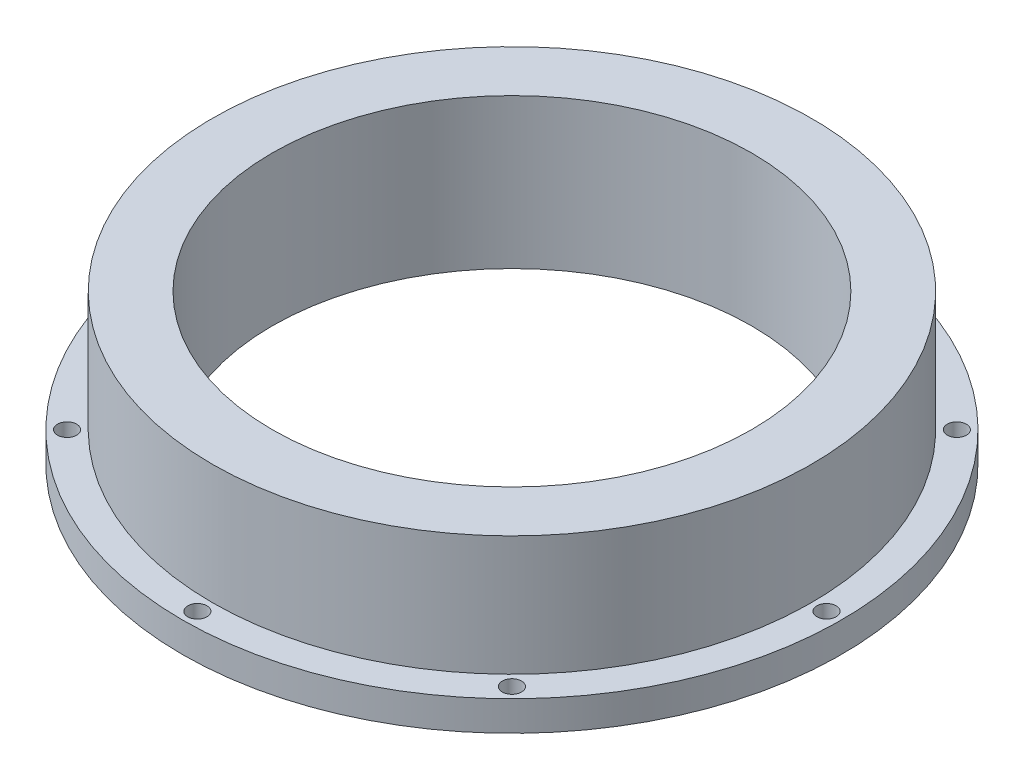
ISO-10303-21;
HEADER;
FILE_DESCRIPTION(('STEP AP214'),'2;1');
FILE_NAME('part.step','',(''),(''),'','','');
FILE_SCHEMA(('AUTOMOTIVE_DESIGN { 1 0 10303 214 1 1 1 1 }'));
ENDSEC;
DATA;
#1=APPLICATION_CONTEXT('core data for automotive mechanical design processes');
#2=APPLICATION_PROTOCOL_DEFINITION('international standard','automotive_design',2000,#1);
#3=PRODUCT_CONTEXT('',#1,'mechanical');
#4=PRODUCT('Part','Part','',(#3));
#5=PRODUCT_RELATED_PRODUCT_CATEGORY('part','',(#4));
#6=PRODUCT_DEFINITION_FORMATION('','',#4);
#7=PRODUCT_DEFINITION_CONTEXT('part definition',#1,'design');
#8=PRODUCT_DEFINITION('design','',#6,#7);
#9=PRODUCT_DEFINITION_SHAPE('','',#8);
#10=(LENGTH_UNIT() NAMED_UNIT(*) SI_UNIT(.MILLI.,.METRE.));
#11=(NAMED_UNIT(*) PLANE_ANGLE_UNIT() SI_UNIT($,.RADIAN.));
#12=(NAMED_UNIT(*) SI_UNIT($,.STERADIAN.) SOLID_ANGLE_UNIT());
#13=UNCERTAINTY_MEASURE_WITH_UNIT(LENGTH_MEASURE(1.E-05),#10,'distance_accuracy_value','');
#14=(GEOMETRIC_REPRESENTATION_CONTEXT(3) GLOBAL_UNCERTAINTY_ASSIGNED_CONTEXT((#13)) GLOBAL_UNIT_ASSIGNED_CONTEXT((#10,
#11,#12)) REPRESENTATION_CONTEXT('',''));
#15=CARTESIAN_POINT('',(0.,0.,0.));
#16=DIRECTION('',(0.,0.,1.));
#17=DIRECTION('',(1.,0.,0.));
#18=AXIS2_PLACEMENT_3D('',#15,#16,#17);
#19=CARTESIAN_POINT('',(0.,5.,0.));
#20=DIRECTION('',(0.,1.,0.));
#21=DIRECTION('',(0.,0.,1.));
#22=AXIS2_PLACEMENT_3D('',#19,#20,#21);
#23=PLANE('',#22);
#24=CARTESIAN_POINT('',(0.,5.,0.));
#25=DIRECTION('',(0.,1.,0.));
#26=DIRECTION('',(0.,0.,1.));
#27=AXIS2_PLACEMENT_3D('',#24,#25,#26);
#28=CIRCLE('',#27,50.);
#29=CARTESIAN_POINT('',(0.,5.,50.));
#30=VERTEX_POINT('',#29);
#31=EDGE_CURVE('E120',#30,#30,#28,.T.);
#32=ORIENTED_EDGE('',*,*,#31,.F.);
#33=EDGE_LOOP('',(#32));
#34=FACE_BOUND('',#33,.T.);
#35=CARTESIAN_POINT('',(-52.5,5.,0.));
#36=DIRECTION('',(0.,1.,0.));
#37=DIRECTION('',(0.,0.,1.));
#38=AXIS2_PLACEMENT_3D('',#35,#36,#37);
#39=CIRCLE('',#38,1.6);
#40=CARTESIAN_POINT('',(-52.5,5.,1.60000000000001));
#41=VERTEX_POINT('',#40);
#42=EDGE_CURVE('E100',#41,#41,#39,.T.);
#43=ORIENTED_EDGE('',*,*,#42,.F.);
#44=EDGE_LOOP('',(#43));
#45=FACE_BOUND('',#44,.T.);
#46=CARTESIAN_POINT('',(0.,5.,52.5));
#47=DIRECTION('',(0.,1.,0.));
#48=DIRECTION('',(0.,0.,1.));
#49=AXIS2_PLACEMENT_3D('',#46,#47,#48);
#50=CIRCLE('',#49,1.6);
#51=CARTESIAN_POINT('',(0.,5.,54.1));
#52=VERTEX_POINT('',#51);
#53=EDGE_CURVE('E84',#52,#52,#50,.T.);
#54=ORIENTED_EDGE('',*,*,#53,.F.);
#55=EDGE_LOOP('',(#54));
#56=FACE_BOUND('',#55,.T.);
#57=CARTESIAN_POINT('',(52.5,5.,0.));
#58=DIRECTION('',(0.,1.,0.));
#59=DIRECTION('',(0.,0.,1.));
#60=AXIS2_PLACEMENT_3D('',#57,#58,#59);
#61=CIRCLE('',#60,1.60000000000001);
#62=CARTESIAN_POINT('',(52.5,5.,1.6));
#63=VERTEX_POINT('',#62);
#64=EDGE_CURVE('E68',#63,#63,#61,.T.);
#65=ORIENTED_EDGE('',*,*,#64,.F.);
#66=EDGE_LOOP('',(#65));
#67=FACE_BOUND('',#66,.T.);
#68=CARTESIAN_POINT('',(0.,5.,-52.5));
#69=DIRECTION('',(0.,1.,0.));
#70=DIRECTION('',(0.,0.,1.));
#71=AXIS2_PLACEMENT_3D('',#68,#69,#70);
#72=CIRCLE('',#71,1.6);
#73=CARTESIAN_POINT('',(0.,5.,-50.9));
#74=VERTEX_POINT('',#73);
#75=EDGE_CURVE('E54',#74,#74,#72,.T.);
#76=ORIENTED_EDGE('',*,*,#75,.F.);
#77=EDGE_LOOP('',(#76));
#78=FACE_BOUND('',#77,.T.);
#79=CARTESIAN_POINT('',(0.,5.,0.));
#80=DIRECTION('',(0.,1.,0.));
#81=DIRECTION('',(0.,0.,1.));
#82=AXIS2_PLACEMENT_3D('',#79,#80,#81);
#83=CIRCLE('',#82,55.);
#84=CARTESIAN_POINT('',(0.,5.,55.));
#85=VERTEX_POINT('',#84);
#86=EDGE_CURVE('E10',#85,#85,#83,.T.);
#87=ORIENTED_EDGE('',*,*,#86,.T.);
#88=EDGE_LOOP('',(#87));
#89=FACE_BOUND('',#88,.T.);
#90=CARTESIAN_POINT('',(37.1231060122937,5.,-37.1231060122937));
#91=DIRECTION('',(0.,1.,0.));
#92=DIRECTION('',(0.,0.,1.));
#93=AXIS2_PLACEMENT_3D('',#90,#91,#92);
#94=CIRCLE('',#93,1.6);
#95=CARTESIAN_POINT('',(37.1231060122937,5.,-35.5231060122937));
#96=VERTEX_POINT('',#95);
#97=EDGE_CURVE('E60',#96,#96,#94,.T.);
#98=ORIENTED_EDGE('',*,*,#97,.F.);
#99=EDGE_LOOP('',(#98));
#100=FACE_BOUND('',#99,.T.);
#101=CARTESIAN_POINT('',(37.1231060122937,5.,37.1231060122937));
#102=DIRECTION('',(0.,1.,0.));
#103=DIRECTION('',(0.,0.,1.));
#104=AXIS2_PLACEMENT_3D('',#101,#102,#103);
#105=CIRCLE('',#104,1.60000000000001);
#106=CARTESIAN_POINT('',(37.1231060122937,5.,38.7231060122937));
#107=VERTEX_POINT('',#106);
#108=EDGE_CURVE('E76',#107,#107,#105,.T.);
#109=ORIENTED_EDGE('',*,*,#108,.F.);
#110=EDGE_LOOP('',(#109));
#111=FACE_BOUND('',#110,.T.);
#112=CARTESIAN_POINT('',(-37.1231060122937,5.,37.1231060122938));
#113=DIRECTION('',(0.,1.,0.));
#114=DIRECTION('',(0.,0.,1.));
#115=AXIS2_PLACEMENT_3D('',#112,#113,#114);
#116=CIRCLE('',#115,1.60000000000001);
#117=CARTESIAN_POINT('',(-37.1231060122937,5.,38.7231060122938));
#118=VERTEX_POINT('',#117);
#119=EDGE_CURVE('E92',#118,#118,#116,.T.);
#120=ORIENTED_EDGE('',*,*,#119,.F.);
#121=EDGE_LOOP('',(#120));
#122=FACE_BOUND('',#121,.T.);
#123=CARTESIAN_POINT('',(-37.1231060122938,5.,-37.1231060122937));
#124=DIRECTION('',(0.,1.,0.));
#125=DIRECTION('',(0.,0.,1.));
#126=AXIS2_PLACEMENT_3D('',#123,#124,#125);
#127=CIRCLE('',#126,1.6);
#128=CARTESIAN_POINT('',(-37.1231060122938,5.,-35.5231060122937));
#129=VERTEX_POINT('',#128);
#130=EDGE_CURVE('E108',#129,#129,#127,.T.);
#131=ORIENTED_EDGE('',*,*,#130,.F.);
#132=EDGE_LOOP('',(#131));
#133=FACE_BOUND('',#132,.T.);
#134=ADVANCED_FACE('F41',(#34,#45,#56,#67,#78,#89,#100,#111,#122,#133),#23,.T.);
#135=CARTESIAN_POINT('',(0.,0.,0.));
#136=DIRECTION('',(0.,1.,0.));
#137=DIRECTION('',(0.,0.,1.));
#138=AXIS2_PLACEMENT_3D('',#135,#136,#137);
#139=PLANE('',#138);
#140=CARTESIAN_POINT('',(0.,0.,0.));
#141=DIRECTION('',(0.,1.,0.));
#142=DIRECTION('',(0.,0.,1.));
#143=AXIS2_PLACEMENT_3D('',#140,#141,#142);
#144=CIRCLE('',#143,40.);
#145=CARTESIAN_POINT('',(0.,0.,40.));
#146=VERTEX_POINT('',#145);
#147=EDGE_CURVE('E124',#146,#146,#144,.T.);
#148=ORIENTED_EDGE('',*,*,#147,.T.);
#149=EDGE_LOOP('',(#148));
#150=FACE_BOUND('',#149,.T.);
#151=CARTESIAN_POINT('',(0.,0.,0.));
#152=DIRECTION('',(0.,1.,0.));
#153=DIRECTION('',(0.,0.,1.));
#154=AXIS2_PLACEMENT_3D('',#151,#152,#153);
#155=CIRCLE('',#154,55.);
#156=CARTESIAN_POINT('',(0.,0.,55.));
#157=VERTEX_POINT('',#156);
#158=EDGE_CURVE('E45',#157,#157,#155,.T.);
#159=ORIENTED_EDGE('',*,*,#158,.F.);
#160=EDGE_LOOP('',(#159));
#161=FACE_BOUND('',#160,.T.);
#162=CARTESIAN_POINT('',(0.,0.,-52.5));
#163=DIRECTION('',(0.,1.,0.));
#164=DIRECTION('',(0.,0.,1.));
#165=AXIS2_PLACEMENT_3D('',#162,#163,#164);
#166=CIRCLE('',#165,1.6);
#167=CARTESIAN_POINT('',(0.,0.,-50.9));
#168=VERTEX_POINT('',#167);
#169=EDGE_CURVE('E56',#168,#168,#166,.T.);
#170=ORIENTED_EDGE('',*,*,#169,.T.);
#171=EDGE_LOOP('',(#170));
#172=FACE_BOUND('',#171,.T.);
#173=CARTESIAN_POINT('',(37.1231060122937,0.,-37.1231060122937));
#174=DIRECTION('',(0.,1.,0.));
#175=DIRECTION('',(0.,0.,1.));
#176=AXIS2_PLACEMENT_3D('',#173,#174,#175);
#177=CIRCLE('',#176,1.6);
#178=CARTESIAN_POINT('',(37.1231060122937,0.,-35.5231060122937));
#179=VERTEX_POINT('',#178);
#180=EDGE_CURVE('E64',#179,#179,#177,.T.);
#181=ORIENTED_EDGE('',*,*,#180,.T.);
#182=EDGE_LOOP('',(#181));
#183=FACE_BOUND('',#182,.T.);
#184=CARTESIAN_POINT('',(52.5,0.,0.));
#185=DIRECTION('',(0.,1.,0.));
#186=DIRECTION('',(0.,0.,1.));
#187=AXIS2_PLACEMENT_3D('',#184,#185,#186);
#188=CIRCLE('',#187,1.60000000000001);
#189=CARTESIAN_POINT('',(52.5,0.,1.6));
#190=VERTEX_POINT('',#189);
#191=EDGE_CURVE('E72',#190,#190,#188,.T.);
#192=ORIENTED_EDGE('',*,*,#191,.T.);
#193=EDGE_LOOP('',(#192));
#194=FACE_BOUND('',#193,.T.);
#195=CARTESIAN_POINT('',(37.1231060122937,0.,37.1231060122937));
#196=DIRECTION('',(0.,1.,0.));
#197=DIRECTION('',(0.,0.,1.));
#198=AXIS2_PLACEMENT_3D('',#195,#196,#197);
#199=CIRCLE('',#198,1.60000000000001);
#200=CARTESIAN_POINT('',(37.1231060122937,0.,38.7231060122937));
#201=VERTEX_POINT('',#200);
#202=EDGE_CURVE('E80',#201,#201,#199,.T.);
#203=ORIENTED_EDGE('',*,*,#202,.T.);
#204=EDGE_LOOP('',(#203));
#205=FACE_BOUND('',#204,.T.);
#206=CARTESIAN_POINT('',(0.,0.,52.5));
#207=DIRECTION('',(0.,1.,0.));
#208=DIRECTION('',(0.,0.,1.));
#209=AXIS2_PLACEMENT_3D('',#206,#207,#208);
#210=CIRCLE('',#209,1.6);
#211=CARTESIAN_POINT('',(0.,0.,54.1));
#212=VERTEX_POINT('',#211);
#213=EDGE_CURVE('E88',#212,#212,#210,.T.);
#214=ORIENTED_EDGE('',*,*,#213,.T.);
#215=EDGE_LOOP('',(#214));
#216=FACE_BOUND('',#215,.T.);
#217=CARTESIAN_POINT('',(-37.1231060122937,0.,37.1231060122938));
#218=DIRECTION('',(0.,1.,0.));
#219=DIRECTION('',(0.,0.,1.));
#220=AXIS2_PLACEMENT_3D('',#217,#218,#219);
#221=CIRCLE('',#220,1.60000000000001);
#222=CARTESIAN_POINT('',(-37.1231060122937,0.,38.7231060122938));
#223=VERTEX_POINT('',#222);
#224=EDGE_CURVE('E96',#223,#223,#221,.T.);
#225=ORIENTED_EDGE('',*,*,#224,.T.);
#226=EDGE_LOOP('',(#225));
#227=FACE_BOUND('',#226,.T.);
#228=CARTESIAN_POINT('',(-52.5,0.,0.));
#229=DIRECTION('',(0.,1.,0.));
#230=DIRECTION('',(0.,0.,1.));
#231=AXIS2_PLACEMENT_3D('',#228,#229,#230);
#232=CIRCLE('',#231,1.6);
#233=CARTESIAN_POINT('',(-52.5,0.,1.60000000000001));
#234=VERTEX_POINT('',#233);
#235=EDGE_CURVE('E104',#234,#234,#232,.T.);
#236=ORIENTED_EDGE('',*,*,#235,.T.);
#237=EDGE_LOOP('',(#236));
#238=FACE_BOUND('',#237,.T.);
#239=CARTESIAN_POINT('',(-37.1231060122938,0.,-37.1231060122937));
#240=DIRECTION('',(0.,1.,0.));
#241=DIRECTION('',(0.,0.,1.));
#242=AXIS2_PLACEMENT_3D('',#239,#240,#241);
#243=CIRCLE('',#242,1.6);
#244=CARTESIAN_POINT('',(-37.1231060122938,0.,-35.5231060122937));
#245=VERTEX_POINT('',#244);
#246=EDGE_CURVE('E112',#245,#245,#243,.T.);
#247=ORIENTED_EDGE('',*,*,#246,.T.);
#248=EDGE_LOOP('',(#247));
#249=FACE_BOUND('',#248,.T.);
#250=ADVANCED_FACE('F136',(#150,#161,#172,#183,#194,#205,#216,#227,#238,#249),#139,.F.);
#251=CARTESIAN_POINT('',(0.,5.,0.));
#252=DIRECTION('',(0.,-1.,0.));
#253=DIRECTION('',(0.,0.,-1.));
#254=AXIS2_PLACEMENT_3D('',#251,#252,#253);
#255=CYLINDRICAL_SURFACE('',#254,55.);
#256=ORIENTED_EDGE('',*,*,#86,.F.);
#257=EDGE_LOOP('',(#256));
#258=FACE_BOUND('',#257,.T.);
#259=ORIENTED_EDGE('',*,*,#158,.T.);
#260=EDGE_LOOP('',(#259));
#261=FACE_BOUND('',#260,.T.);
#262=ADVANCED_FACE('F43',(#258,#261),#255,.T.);
#263=CARTESIAN_POINT('',(0.,5.,-52.5));
#264=DIRECTION('',(0.,-1.,0.));
#265=DIRECTION('',(0.,0.,-1.));
#266=AXIS2_PLACEMENT_3D('',#263,#264,#265);
#267=CYLINDRICAL_SURFACE('',#266,1.6);
#268=ORIENTED_EDGE('',*,*,#75,.T.);
#269=EDGE_LOOP('',(#268));
#270=FACE_BOUND('',#269,.T.);
#271=ORIENTED_EDGE('',*,*,#169,.F.);
#272=EDGE_LOOP('',(#271));
#273=FACE_BOUND('',#272,.T.);
#274=ADVANCED_FACE('F187',(#270,#273),#267,.F.);
#275=CARTESIAN_POINT('',(37.1231060122937,5.,-37.1231060122937));
#276=DIRECTION('',(0.,-1.,0.));
#277=DIRECTION('',(0.,0.,-1.));
#278=AXIS2_PLACEMENT_3D('',#275,#276,#277);
#279=CYLINDRICAL_SURFACE('',#278,1.6);
#280=ORIENTED_EDGE('',*,*,#97,.T.);
#281=EDGE_LOOP('',(#280));
#282=FACE_BOUND('',#281,.T.);
#283=ORIENTED_EDGE('',*,*,#180,.F.);
#284=EDGE_LOOP('',(#283));
#285=FACE_BOUND('',#284,.T.);
#286=ADVANCED_FACE('F192',(#282,#285),#279,.F.);
#287=CARTESIAN_POINT('',(52.5,5.,0.));
#288=DIRECTION('',(0.,-1.,0.));
#289=DIRECTION('',(0.,0.,-1.));
#290=AXIS2_PLACEMENT_3D('',#287,#288,#289);
#291=CYLINDRICAL_SURFACE('',#290,1.60000000000001);
#292=ORIENTED_EDGE('',*,*,#64,.T.);
#293=EDGE_LOOP('',(#292));
#294=FACE_BOUND('',#293,.T.);
#295=ORIENTED_EDGE('',*,*,#191,.F.);
#296=EDGE_LOOP('',(#295));
#297=FACE_BOUND('',#296,.T.);
#298=ADVANCED_FACE('F196',(#294,#297),#291,.F.);
#299=CARTESIAN_POINT('',(37.1231060122937,5.,37.1231060122937));
#300=DIRECTION('',(0.,-1.,0.));
#301=DIRECTION('',(0.,0.,-1.));
#302=AXIS2_PLACEMENT_3D('',#299,#300,#301);
#303=CYLINDRICAL_SURFACE('',#302,1.60000000000001);
#304=ORIENTED_EDGE('',*,*,#108,.T.);
#305=EDGE_LOOP('',(#304));
#306=FACE_BOUND('',#305,.T.);
#307=ORIENTED_EDGE('',*,*,#202,.F.);
#308=EDGE_LOOP('',(#307));
#309=FACE_BOUND('',#308,.T.);
#310=ADVANCED_FACE('F200',(#306,#309),#303,.F.);
#311=CARTESIAN_POINT('',(0.,5.,52.5));
#312=DIRECTION('',(0.,-1.,0.));
#313=DIRECTION('',(0.,0.,-1.));
#314=AXIS2_PLACEMENT_3D('',#311,#312,#313);
#315=CYLINDRICAL_SURFACE('',#314,1.6);
#316=ORIENTED_EDGE('',*,*,#53,.T.);
#317=EDGE_LOOP('',(#316));
#318=FACE_BOUND('',#317,.T.);
#319=ORIENTED_EDGE('',*,*,#213,.F.);
#320=EDGE_LOOP('',(#319));
#321=FACE_BOUND('',#320,.T.);
#322=ADVANCED_FACE('F204',(#318,#321),#315,.F.);
#323=CARTESIAN_POINT('',(-37.1231060122937,5.,37.1231060122938));
#324=DIRECTION('',(0.,-1.,0.));
#325=DIRECTION('',(0.,0.,-1.));
#326=AXIS2_PLACEMENT_3D('',#323,#324,#325);
#327=CYLINDRICAL_SURFACE('',#326,1.60000000000001);
#328=ORIENTED_EDGE('',*,*,#119,.T.);
#329=EDGE_LOOP('',(#328));
#330=FACE_BOUND('',#329,.T.);
#331=ORIENTED_EDGE('',*,*,#224,.F.);
#332=EDGE_LOOP('',(#331));
#333=FACE_BOUND('',#332,.T.);
#334=ADVANCED_FACE('F208',(#330,#333),#327,.F.);
#335=CARTESIAN_POINT('',(-52.5,5.,0.));
#336=DIRECTION('',(0.,-1.,0.));
#337=DIRECTION('',(0.,0.,-1.));
#338=AXIS2_PLACEMENT_3D('',#335,#336,#337);
#339=CYLINDRICAL_SURFACE('',#338,1.6);
#340=ORIENTED_EDGE('',*,*,#42,.T.);
#341=EDGE_LOOP('',(#340));
#342=FACE_BOUND('',#341,.T.);
#343=ORIENTED_EDGE('',*,*,#235,.F.);
#344=EDGE_LOOP('',(#343));
#345=FACE_BOUND('',#344,.T.);
#346=ADVANCED_FACE('F179',(#342,#345),#339,.F.);
#347=CARTESIAN_POINT('',(-37.1231060122938,5.,-37.1231060122937));
#348=DIRECTION('',(0.,-1.,0.));
#349=DIRECTION('',(0.,0.,-1.));
#350=AXIS2_PLACEMENT_3D('',#347,#348,#349);
#351=CYLINDRICAL_SURFACE('',#350,1.6);
#352=ORIENTED_EDGE('',*,*,#130,.T.);
#353=EDGE_LOOP('',(#352));
#354=FACE_BOUND('',#353,.T.);
#355=ORIENTED_EDGE('',*,*,#246,.F.);
#356=EDGE_LOOP('',(#355));
#357=FACE_BOUND('',#356,.T.);
#358=ADVANCED_FACE('F154',(#354,#357),#351,.F.);
#359=CARTESIAN_POINT('',(0.,25.,0.));
#360=DIRECTION('',(0.,-1.,0.));
#361=DIRECTION('',(0.,0.,-1.));
#362=AXIS2_PLACEMENT_3D('',#359,#360,#361);
#363=CYLINDRICAL_SURFACE('',#362,50.);
#364=CARTESIAN_POINT('',(0.,25.,0.));
#365=DIRECTION('',(0.,1.,0.));
#366=DIRECTION('',(0.,0.,1.));
#367=AXIS2_PLACEMENT_3D('',#364,#365,#366);
#368=CIRCLE('',#367,50.);
#369=CARTESIAN_POINT('',(0.,25.,50.));
#370=VERTEX_POINT('',#369);
#371=EDGE_CURVE('E116',#370,#370,#368,.T.);
#372=ORIENTED_EDGE('',*,*,#371,.F.);
#373=EDGE_LOOP('',(#372));
#374=FACE_BOUND('',#373,.T.);
#375=ORIENTED_EDGE('',*,*,#31,.T.);
#376=EDGE_LOOP('',(#375));
#377=FACE_BOUND('',#376,.T.);
#378=ADVANCED_FACE('F148',(#374,#377),#363,.T.);
#379=CARTESIAN_POINT('',(0.,25.,0.));
#380=DIRECTION('',(0.,1.,0.));
#381=DIRECTION('',(0.,0.,1.));
#382=AXIS2_PLACEMENT_3D('',#379,#380,#381);
#383=PLANE('',#382);
#384=CARTESIAN_POINT('',(0.,25.,0.));
#385=DIRECTION('',(0.,1.,0.));
#386=DIRECTION('',(0.,0.,1.));
#387=AXIS2_PLACEMENT_3D('',#384,#385,#386);
#388=CIRCLE('',#387,40.);
#389=CARTESIAN_POINT('',(0.,25.,40.));
#390=VERTEX_POINT('',#389);
#391=EDGE_CURVE('E128',#390,#390,#388,.T.);
#392=ORIENTED_EDGE('',*,*,#391,.F.);
#393=EDGE_LOOP('',(#392));
#394=FACE_BOUND('',#393,.T.);
#395=ORIENTED_EDGE('',*,*,#371,.T.);
#396=EDGE_LOOP('',(#395));
#397=FACE_BOUND('',#396,.T.);
#398=ADVANCED_FACE('F142',(#394,#397),#383,.T.);
#399=CARTESIAN_POINT('',(0.,0.,0.));
#400=DIRECTION('',(0.,1.,0.));
#401=DIRECTION('',(0.,0.,1.));
#402=AXIS2_PLACEMENT_3D('',#399,#400,#401);
#403=CYLINDRICAL_SURFACE('',#402,40.);
#404=ORIENTED_EDGE('',*,*,#147,.F.);
#405=EDGE_LOOP('',(#404));
#406=FACE_BOUND('',#405,.T.);
#407=ORIENTED_EDGE('',*,*,#391,.T.);
#408=EDGE_LOOP('',(#407));
#409=FACE_BOUND('',#408,.T.);
#410=ADVANCED_FACE('F139',(#406,#409),#403,.F.);
#411=CLOSED_SHELL('',(#134,#250,#262,#274,#286,#298,#310,#322,#334,#346,#358,#378,#398,#410));
#412=MANIFOLD_SOLID_BREP('B2',#411);
#413=ADVANCED_BREP_SHAPE_REPRESENTATION('',(#18,#412),#14);
#414=SHAPE_DEFINITION_REPRESENTATION(#9,#413);
ENDSEC;
END-ISO-10303-21;
